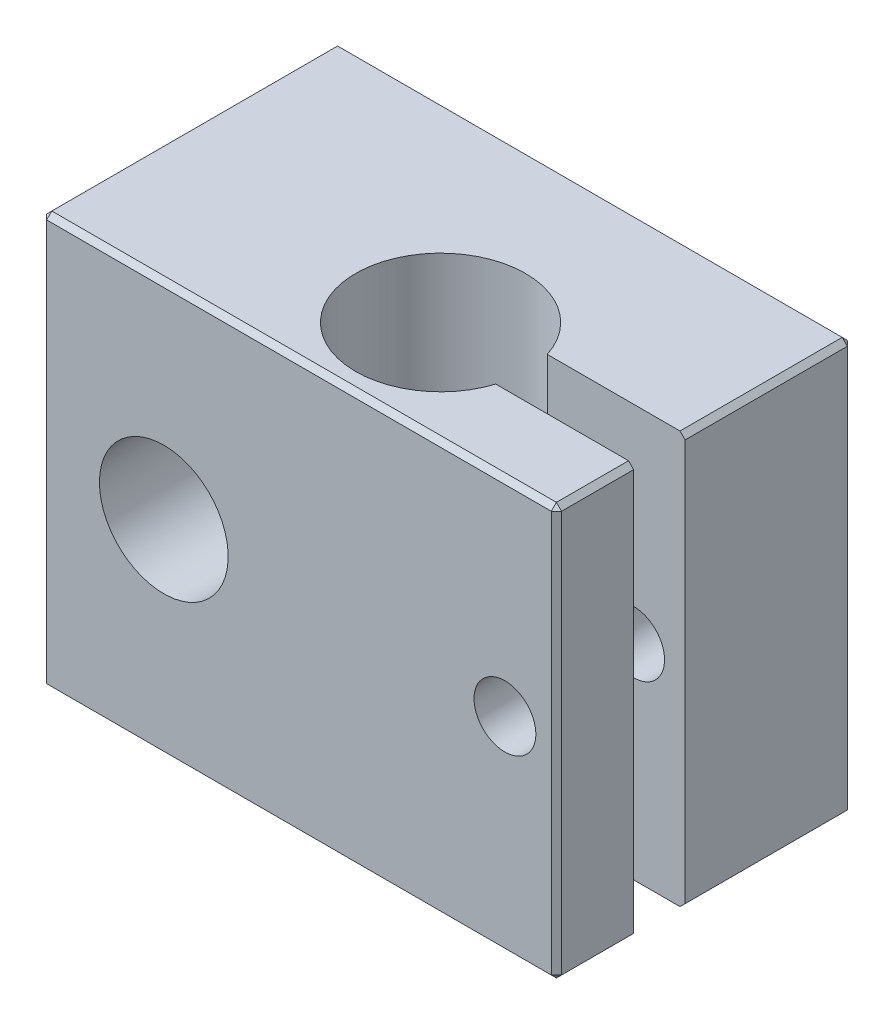
ISO-10303-21;
HEADER;
FILE_DESCRIPTION(('STEP AP214'),'2;1');
FILE_NAME('part.step','',(''),(''),'','','');
FILE_SCHEMA(('AUTOMOTIVE_DESIGN { 1 0 10303 214 1 1 1 1 }'));
ENDSEC;
DATA;
#1=APPLICATION_CONTEXT('core data for automotive mechanical design processes');
#2=APPLICATION_PROTOCOL_DEFINITION('international standard','automotive_design',2000,#1);
#3=PRODUCT_CONTEXT('',#1,'mechanical');
#4=PRODUCT('Part','Part','',(#3));
#5=PRODUCT_RELATED_PRODUCT_CATEGORY('part','',(#4));
#6=PRODUCT_DEFINITION_FORMATION('','',#4);
#7=PRODUCT_DEFINITION_CONTEXT('part definition',#1,'design');
#8=PRODUCT_DEFINITION('design','',#6,#7);
#9=PRODUCT_DEFINITION_SHAPE('','',#8);
#10=(LENGTH_UNIT() NAMED_UNIT(*) SI_UNIT(.MILLI.,.METRE.));
#11=(NAMED_UNIT(*) PLANE_ANGLE_UNIT() SI_UNIT($,.RADIAN.));
#12=(NAMED_UNIT(*) SI_UNIT($,.STERADIAN.) SOLID_ANGLE_UNIT());
#13=UNCERTAINTY_MEASURE_WITH_UNIT(LENGTH_MEASURE(1.E-05),#10,'distance_accuracy_value','');
#14=(GEOMETRIC_REPRESENTATION_CONTEXT(3) GLOBAL_UNCERTAINTY_ASSIGNED_CONTEXT((#13)) GLOBAL_UNIT_ASSIGNED_CONTEXT((#10,
#11,#12)) REPRESENTATION_CONTEXT('',''));
#15=CARTESIAN_POINT('',(0.,0.,0.));
#16=DIRECTION('',(0.,0.,1.));
#17=DIRECTION('',(1.,0.,0.));
#18=AXIS2_PLACEMENT_3D('',#15,#16,#17);
#19=CARTESIAN_POINT('',(15.25,8.,11.5));
#20=DIRECTION('',(1.,0.,0.));
#21=DIRECTION('',(0.,1.,0.));
#22=AXIS2_PLACEMENT_3D('',#19,#20,#21);
#23=PLANE('',#22);
#24=DIRECTION('',(0.,1.,0.));
#25=VECTOR('',#24,1.);
#26=CARTESIAN_POINT('',(15.25,-8.,8.5));
#27=LINE('',#26,#25);
#28=CARTESIAN_POINT('',(15.25,-7.80000000000001,8.5));
#29=VERTEX_POINT('',#28);
#30=CARTESIAN_POINT('',(15.25,7.80000000000001,8.5));
#31=VERTEX_POINT('',#30);
#32=EDGE_CURVE('E209',#29,#31,#27,.T.);
#33=ORIENTED_EDGE('',*,*,#32,.T.);
#34=DIRECTION('',(0.,0.,1.));
#35=VECTOR('',#34,1.);
#36=CARTESIAN_POINT('',(15.25,7.80000000000001,11.5));
#37=LINE('',#36,#35);
#38=CARTESIAN_POINT('',(15.25,7.80000000000001,11.3));
#39=VERTEX_POINT('',#38);
#40=EDGE_CURVE('E283',#31,#39,#37,.T.);
#41=ORIENTED_EDGE('',*,*,#40,.T.);
#42=DIRECTION('',(0.,-1.,0.));
#43=VECTOR('',#42,1.);
#44=CARTESIAN_POINT('',(15.25,-8.,11.3));
#45=LINE('',#44,#43);
#46=CARTESIAN_POINT('',(15.25,-7.80000000000001,11.3));
#47=VERTEX_POINT('',#46);
#48=EDGE_CURVE('E279',#39,#47,#45,.T.);
#49=ORIENTED_EDGE('',*,*,#48,.T.);
#50=DIRECTION('',(0.,0.,-1.));
#51=VECTOR('',#50,1.);
#52=CARTESIAN_POINT('',(15.25,-7.80000000000001,11.5));
#53=LINE('',#52,#51);
#54=EDGE_CURVE('E281',#47,#29,#53,.T.);
#55=ORIENTED_EDGE('',*,*,#54,.T.);
#56=EDGE_LOOP('',(#33,#41,#49,#55));
#57=FACE_BOUND('',#56,.T.);
#58=ADVANCED_FACE('F34',(#57),#23,.T.);
#59=DIRECTION('',(0.,1.,0.));
#60=VECTOR('',#59,1.);
#61=CARTESIAN_POINT('',(15.25,8.,0.199999999999995));
#62=LINE('',#61,#60);
#63=CARTESIAN_POINT('',(15.25,-7.80000000000001,0.199999999999995));
#64=VERTEX_POINT('',#63);
#65=CARTESIAN_POINT('',(15.25,7.80000000000001,0.199999999999995));
#66=VERTEX_POINT('',#65);
#67=EDGE_CURVE('E237',#64,#66,#62,.T.);
#68=ORIENTED_EDGE('',*,*,#67,.T.);
#69=DIRECTION('',(0.,0.,1.));
#70=VECTOR('',#69,1.);
#71=CARTESIAN_POINT('',(15.25,7.80000000000001,11.5));
#72=LINE('',#71,#70);
#73=CARTESIAN_POINT('',(15.25,7.80000000000001,6.5));
#74=VERTEX_POINT('',#73);
#75=EDGE_CURVE('E241',#66,#74,#72,.T.);
#76=ORIENTED_EDGE('',*,*,#75,.T.);
#77=DIRECTION('',(0.,1.,0.));
#78=VECTOR('',#77,1.);
#79=CARTESIAN_POINT('',(15.25,-8.,6.5));
#80=LINE('',#79,#78);
#81=CARTESIAN_POINT('',(15.25,-7.80000000000001,6.5));
#82=VERTEX_POINT('',#81);
#83=EDGE_CURVE('E220',#82,#74,#80,.T.);
#84=ORIENTED_EDGE('',*,*,#83,.F.);
#85=DIRECTION('',(0.,0.,-1.));
#86=VECTOR('',#85,1.);
#87=CARTESIAN_POINT('',(15.25,-7.80000000000001,11.5));
#88=LINE('',#87,#86);
#89=EDGE_CURVE('E239',#82,#64,#88,.T.);
#90=ORIENTED_EDGE('',*,*,#89,.T.);
#91=EDGE_LOOP('',(#68,#76,#84,#90));
#92=FACE_BOUND('',#91,.T.);
#93=ADVANCED_FACE('F395',(#92),#23,.T.);
#94=CARTESIAN_POINT('',(-4.75,8.,11.5));
#95=DIRECTION('',(0.,1.,0.));
#96=DIRECTION('',(0.,0.,1.));
#97=AXIS2_PLACEMENT_3D('',#94,#95,#96);
#98=PLANE('',#97);
#99=DIRECTION('',(-1.,0.,0.));
#100=VECTOR('',#99,1.);
#101=CARTESIAN_POINT('',(15.25,8.,6.5));
#102=LINE('',#101,#100);
#103=CARTESIAN_POINT('',(15.05,8.,6.5));
#104=VERTEX_POINT('',#103);
#105=CARTESIAN_POINT('',(9.89483703870327,8.,6.5));
#106=VERTEX_POINT('',#105);
#107=EDGE_CURVE('E207',#104,#106,#102,.T.);
#108=ORIENTED_EDGE('',*,*,#107,.F.);
#109=DIRECTION('',(0.,0.,-1.));
#110=VECTOR('',#109,1.);
#111=CARTESIAN_POINT('',(15.05,8.,11.5));
#112=LINE('',#111,#110);
#113=CARTESIAN_POINT('',(15.05,8.,0.199999999999995));
#114=VERTEX_POINT('',#113);
#115=EDGE_CURVE('E234',#104,#114,#112,.T.);
#116=ORIENTED_EDGE('',*,*,#115,.T.);
#117=DIRECTION('',(-1.,0.,0.));
#118=VECTOR('',#117,1.);
#119=CARTESIAN_POINT('',(-4.75,8.,0.199999999999995));
#120=LINE('',#119,#118);
#121=CARTESIAN_POINT('',(-4.55000000000001,8.,0.199999999999995));
#122=VERTEX_POINT('',#121);
#123=EDGE_CURVE('E232',#114,#122,#120,.T.);
#124=ORIENTED_EDGE('',*,*,#123,.T.);
#125=DIRECTION('',(0.,0.,1.));
#126=VECTOR('',#125,1.);
#127=CARTESIAN_POINT('',(-4.55000000000001,8.,11.5));
#128=LINE('',#127,#126);
#129=CARTESIAN_POINT('',(-4.55000000000001,8.,11.3));
#130=VERTEX_POINT('',#129);
#131=EDGE_CURVE('E228',#122,#130,#128,.T.);
#132=ORIENTED_EDGE('',*,*,#131,.T.);
#133=DIRECTION('',(1.,0.,0.));
#134=VECTOR('',#133,1.);
#135=CARTESIAN_POINT('',(15.25,8.,11.3));
#136=LINE('',#135,#134);
#137=CARTESIAN_POINT('',(15.05,8.,11.3));
#138=VERTEX_POINT('',#137);
#139=EDGE_CURVE('E216',#130,#138,#136,.T.);
#140=ORIENTED_EDGE('',*,*,#139,.T.);
#141=DIRECTION('',(0.,0.,-1.));
#142=VECTOR('',#141,1.);
#143=CARTESIAN_POINT('',(15.05,8.,11.5));
#144=LINE('',#143,#142);
#145=CARTESIAN_POINT('',(15.05,8.,8.5));
#146=VERTEX_POINT('',#145);
#147=EDGE_CURVE('E230',#138,#146,#144,.T.);
#148=ORIENTED_EDGE('',*,*,#147,.T.);
#149=DIRECTION('',(1.,0.,0.));
#150=VECTOR('',#149,1.);
#151=CARTESIAN_POINT('',(9.89483703870327,8.,8.5));
#152=LINE('',#151,#150);
#153=CARTESIAN_POINT('',(9.89483703870327,8.,8.5));
#154=VERTEX_POINT('',#153);
#155=EDGE_CURVE('E202',#154,#146,#152,.T.);
#156=ORIENTED_EDGE('',*,*,#155,.F.);
#157=CARTESIAN_POINT('',(6.75,8.,7.5));
#158=DIRECTION('',(0.,-1.,0.));
#159=DIRECTION('',(0.,0.,-1.));
#160=AXIS2_PLACEMENT_3D('',#157,#158,#159);
#161=CIRCLE('',#160,3.29999999999999);
#162=EDGE_CURVE('E199',#154,#106,#161,.T.);
#163=ORIENTED_EDGE('',*,*,#162,.T.);
#164=EDGE_LOOP('',(#108,#116,#124,#132,#140,#148,#156,#163));
#165=FACE_BOUND('',#164,.T.);
#166=ADVANCED_FACE('F401',(#165),#98,.T.);
#167=CARTESIAN_POINT('',(-4.75,-8.,11.5));
#168=DIRECTION('',(-1.,0.,0.));
#169=DIRECTION('',(0.,-1.,0.));
#170=AXIS2_PLACEMENT_3D('',#167,#168,#169);
#171=PLANE('',#170);
#172=DIRECTION('',(0.,0.,-1.));
#173=VECTOR('',#172,1.);
#174=CARTESIAN_POINT('',(-4.75,7.80000000000001,11.5));
#175=LINE('',#174,#173);
#176=CARTESIAN_POINT('',(-4.75,7.80000000000001,11.3));
#177=VERTEX_POINT('',#176);
#178=CARTESIAN_POINT('',(-4.75,7.80000000000001,0.199999999999995));
#179=VERTEX_POINT('',#178);
#180=EDGE_CURVE('E270',#177,#179,#175,.T.);
#181=ORIENTED_EDGE('',*,*,#180,.T.);
#182=DIRECTION('',(0.,-1.,0.));
#183=VECTOR('',#182,1.);
#184=CARTESIAN_POINT('',(-4.75,-8.,0.199999999999995));
#185=LINE('',#184,#183);
#186=CARTESIAN_POINT('',(-4.75,-7.80000000000001,0.199999999999995));
#187=VERTEX_POINT('',#186);
#188=EDGE_CURVE('E272',#179,#187,#185,.T.);
#189=ORIENTED_EDGE('',*,*,#188,.T.);
#190=DIRECTION('',(0.,0.,1.));
#191=VECTOR('',#190,1.);
#192=CARTESIAN_POINT('',(-4.75,-7.80000000000001,11.5));
#193=LINE('',#192,#191);
#194=CARTESIAN_POINT('',(-4.75,-7.80000000000001,11.3));
#195=VERTEX_POINT('',#194);
#196=EDGE_CURVE('E268',#187,#195,#193,.T.);
#197=ORIENTED_EDGE('',*,*,#196,.T.);
#198=DIRECTION('',(0.,1.,0.));
#199=VECTOR('',#198,1.);
#200=CARTESIAN_POINT('',(-4.75,8.,11.3));
#201=LINE('',#200,#199);
#202=EDGE_CURVE('E266',#195,#177,#201,.T.);
#203=ORIENTED_EDGE('',*,*,#202,.T.);
#204=EDGE_LOOP('',(#181,#189,#197,#203));
#205=FACE_BOUND('',#204,.T.);
#206=ADVANCED_FACE('F516',(#205),#171,.T.);
#207=CARTESIAN_POINT('',(15.25,-8.,11.5));
#208=DIRECTION('',(0.,-1.,0.));
#209=DIRECTION('',(0.,0.,-1.));
#210=AXIS2_PLACEMENT_3D('',#207,#208,#209);
#211=PLANE('',#210);
#212=CARTESIAN_POINT('',(-2.25,-8.,9.));
#213=DIRECTION('',(0.,-1.,0.));
#214=DIRECTION('',(0.,0.,-1.));
#215=AXIS2_PLACEMENT_3D('',#212,#213,#214);
#216=CIRCLE('',#215,0.999999999999994);
#217=CARTESIAN_POINT('',(-2.25,-8.,8.00000000000001));
#218=VERTEX_POINT('',#217);
#219=EDGE_CURVE('E355',#218,#218,#216,.T.);
#220=ORIENTED_EDGE('',*,*,#219,.F.);
#221=EDGE_LOOP('',(#220));
#222=FACE_BOUND('',#221,.T.);
#223=CARTESIAN_POINT('',(-1.25,-8.,6.5));
#224=DIRECTION('',(0.,-1.,0.));
#225=DIRECTION('',(0.,0.,-1.));
#226=AXIS2_PLACEMENT_3D('',#223,#224,#225);
#227=CIRCLE('',#226,1.02499999999999);
#228=CARTESIAN_POINT('',(-1.25,-8.,5.47500000000001));
#229=VERTEX_POINT('',#228);
#230=EDGE_CURVE('E174',#229,#229,#227,.T.);
#231=ORIENTED_EDGE('',*,*,#230,.F.);
#232=EDGE_LOOP('',(#231));
#233=FACE_BOUND('',#232,.T.);
#234=DIRECTION('',(1.,0.,0.));
#235=VECTOR('',#234,1.);
#236=CARTESIAN_POINT('',(15.25,-8.,0.199999999999995));
#237=LINE('',#236,#235);
#238=CARTESIAN_POINT('',(-4.55,-8.,0.199999999999995));
#239=VERTEX_POINT('',#238);
#240=CARTESIAN_POINT('',(15.05,-8.,0.199999999999995));
#241=VERTEX_POINT('',#240);
#242=EDGE_CURVE('E253',#239,#241,#237,.T.);
#243=ORIENTED_EDGE('',*,*,#242,.T.);
#244=DIRECTION('',(0.,0.,1.));
#245=VECTOR('',#244,1.);
#246=CARTESIAN_POINT('',(15.05,-8.,11.5));
#247=LINE('',#246,#245);
#248=CARTESIAN_POINT('',(15.05,-8.,6.5));
#249=VERTEX_POINT('',#248);
#250=EDGE_CURVE('E255',#241,#249,#247,.T.);
#251=ORIENTED_EDGE('',*,*,#250,.T.);
#252=DIRECTION('',(-1.,0.,0.));
#253=VECTOR('',#252,1.);
#254=CARTESIAN_POINT('',(15.25,-8.,6.5));
#255=LINE('',#254,#253);
#256=CARTESIAN_POINT('',(9.89483703870327,-8.,6.5));
#257=VERTEX_POINT('',#256);
#258=EDGE_CURVE('E206',#249,#257,#255,.T.);
#259=ORIENTED_EDGE('',*,*,#258,.T.);
#260=CARTESIAN_POINT('',(6.75,-8.,7.5));
#261=DIRECTION('',(0.,-1.,0.));
#262=DIRECTION('',(0.,0.,-1.));
#263=AXIS2_PLACEMENT_3D('',#260,#261,#262);
#264=CIRCLE('',#263,3.29999999999999);
#265=CARTESIAN_POINT('',(9.89483703870327,-8.,8.5));
#266=VERTEX_POINT('',#265);
#267=EDGE_CURVE('E196',#266,#257,#264,.T.);
#268=ORIENTED_EDGE('',*,*,#267,.F.);
#269=DIRECTION('',(1.,0.,0.));
#270=VECTOR('',#269,1.);
#271=CARTESIAN_POINT('',(9.89483703870327,-8.,8.5));
#272=LINE('',#271,#270);
#273=CARTESIAN_POINT('',(15.05,-8.,8.5));
#274=VERTEX_POINT('',#273);
#275=EDGE_CURVE('E203',#266,#274,#272,.T.);
#276=ORIENTED_EDGE('',*,*,#275,.T.);
#277=DIRECTION('',(0.,0.,1.));
#278=VECTOR('',#277,1.);
#279=CARTESIAN_POINT('',(15.05,-8.,11.5));
#280=LINE('',#279,#278);
#281=CARTESIAN_POINT('',(15.05,-8.,11.3));
#282=VERTEX_POINT('',#281);
#283=EDGE_CURVE('E251',#274,#282,#280,.T.);
#284=ORIENTED_EDGE('',*,*,#283,.T.);
#285=DIRECTION('',(-1.,0.,0.));
#286=VECTOR('',#285,1.);
#287=CARTESIAN_POINT('',(-4.75,-8.,11.3));
#288=LINE('',#287,#286);
#289=CARTESIAN_POINT('',(-4.55,-8.,11.3));
#290=VERTEX_POINT('',#289);
#291=EDGE_CURVE('E247',#282,#290,#288,.T.);
#292=ORIENTED_EDGE('',*,*,#291,.T.);
#293=DIRECTION('',(0.,0.,-1.));
#294=VECTOR('',#293,1.);
#295=CARTESIAN_POINT('',(-4.55,-8.,11.5));
#296=LINE('',#295,#294);
#297=EDGE_CURVE('E249',#290,#239,#296,.T.);
#298=ORIENTED_EDGE('',*,*,#297,.T.);
#299=EDGE_LOOP('',(#243,#251,#259,#268,#276,#284,#292,#298));
#300=FACE_BOUND('',#299,.T.);
#301=ADVANCED_FACE('F405',(#222,#233,#300),#211,.T.);
#302=CARTESIAN_POINT('',(0.,0.,11.5));
#303=DIRECTION('',(0.,0.,-1.));
#304=DIRECTION('',(-1.,0.,0.));
#305=AXIS2_PLACEMENT_3D('',#302,#303,#304);
#306=PLANE('',#305);
#307=DIRECTION('',(0.,1.,0.));
#308=VECTOR('',#307,1.);
#309=CARTESIAN_POINT('',(15.05,8.,11.5));
#310=LINE('',#309,#308);
#311=CARTESIAN_POINT('',(15.05,-7.80000000000001,11.5));
#312=VERTEX_POINT('',#311);
#313=CARTESIAN_POINT('',(15.05,7.80000000000001,11.5));
#314=VERTEX_POINT('',#313);
#315=EDGE_CURVE('E43',#312,#314,#310,.T.);
#316=ORIENTED_EDGE('',*,*,#315,.T.);
#317=DIRECTION('',(-1.,0.,0.));
#318=VECTOR('',#317,1.);
#319=CARTESIAN_POINT('',(-4.75,7.80000000000001,11.5));
#320=LINE('',#319,#318);
#321=CARTESIAN_POINT('',(-4.55000000000001,7.80000000000001,11.5));
#322=VERTEX_POINT('',#321);
#323=EDGE_CURVE('E11',#314,#322,#320,.T.);
#324=ORIENTED_EDGE('',*,*,#323,.T.);
#325=DIRECTION('',(0.,-1.,0.));
#326=VECTOR('',#325,1.);
#327=CARTESIAN_POINT('',(-4.55,-8.,11.5));
#328=LINE('',#327,#326);
#329=CARTESIAN_POINT('',(-4.55,-7.80000000000001,11.5));
#330=VERTEX_POINT('',#329);
#331=EDGE_CURVE('E287',#322,#330,#328,.T.);
#332=ORIENTED_EDGE('',*,*,#331,.T.);
#333=DIRECTION('',(1.,0.,0.));
#334=VECTOR('',#333,1.);
#335=CARTESIAN_POINT('',(15.25,-7.80000000000001,11.5));
#336=LINE('',#335,#334);
#337=EDGE_CURVE('E285',#330,#312,#336,.T.);
#338=ORIENTED_EDGE('',*,*,#337,.T.);
#339=EDGE_LOOP('',(#316,#324,#332,#338));
#340=FACE_BOUND('',#339,.T.);
#341=CARTESIAN_POINT('',(13.25,0.,11.5));
#342=DIRECTION('',(0.,0.,-1.));
#343=DIRECTION('',(-1.,0.,0.));
#344=AXIS2_PLACEMENT_3D('',#341,#342,#343);
#345=CIRCLE('',#344,1.19999999999998);
#346=CARTESIAN_POINT('',(12.05,0.,11.5));
#347=VERTEX_POINT('',#346);
#348=EDGE_CURVE('E177',#347,#347,#345,.T.);
#349=ORIENTED_EDGE('',*,*,#348,.T.);
#350=EDGE_LOOP('',(#349));
#351=FACE_BOUND('',#350,.T.);
#352=CARTESIAN_POINT('',(0.,0.,11.5));
#353=DIRECTION('',(0.,0.,-1.));
#354=DIRECTION('',(-1.,0.,0.));
#355=AXIS2_PLACEMENT_3D('',#352,#353,#354);
#356=CIRCLE('',#355,2.49999999999998);
#357=CARTESIAN_POINT('',(-2.49999999999998,0.,11.5));
#358=VERTEX_POINT('',#357);
#359=EDGE_CURVE('E193',#358,#358,#356,.T.);
#360=ORIENTED_EDGE('',*,*,#359,.T.);
#361=EDGE_LOOP('',(#360));
#362=FACE_BOUND('',#361,.T.);
#363=ADVANCED_FACE('F511',(#340,#351,#362),#306,.F.);
#364=CARTESIAN_POINT('',(0.,0.,0.));
#365=DIRECTION('',(0.,0.,-1.));
#366=DIRECTION('',(-1.,0.,0.));
#367=AXIS2_PLACEMENT_3D('',#364,#365,#366);
#368=PLANE('',#367);
#369=DIRECTION('',(1.,0.,0.));
#370=VECTOR('',#369,1.);
#371=CARTESIAN_POINT('',(0.,7.80000000000001,0.));
#372=LINE('',#371,#370);
#373=CARTESIAN_POINT('',(-4.55000000000001,7.80000000000001,0.));
#374=VERTEX_POINT('',#373);
#375=CARTESIAN_POINT('',(15.05,7.80000000000001,0.));
#376=VERTEX_POINT('',#375);
#377=EDGE_CURVE('E261',#374,#376,#372,.T.);
#378=ORIENTED_EDGE('',*,*,#377,.T.);
#379=DIRECTION('',(0.,-1.,0.));
#380=VECTOR('',#379,1.);
#381=CARTESIAN_POINT('',(15.05,0.,0.));
#382=LINE('',#381,#380);
#383=CARTESIAN_POINT('',(15.05,-7.80000000000001,0.));
#384=VERTEX_POINT('',#383);
#385=EDGE_CURVE('E263',#376,#384,#382,.T.);
#386=ORIENTED_EDGE('',*,*,#385,.T.);
#387=DIRECTION('',(-1.,0.,0.));
#388=VECTOR('',#387,1.);
#389=CARTESIAN_POINT('',(0.,-7.80000000000001,0.));
#390=LINE('',#389,#388);
#391=CARTESIAN_POINT('',(-4.55,-7.80000000000001,0.));
#392=VERTEX_POINT('',#391);
#393=EDGE_CURVE('E259',#384,#392,#390,.T.);
#394=ORIENTED_EDGE('',*,*,#393,.T.);
#395=DIRECTION('',(0.,1.,0.));
#396=VECTOR('',#395,1.);
#397=CARTESIAN_POINT('',(-4.55,0.,0.));
#398=LINE('',#397,#396);
#399=EDGE_CURVE('E257',#392,#374,#398,.T.);
#400=ORIENTED_EDGE('',*,*,#399,.T.);
#401=EDGE_LOOP('',(#378,#386,#394,#400));
#402=FACE_BOUND('',#401,.T.);
#403=CARTESIAN_POINT('',(13.25,0.,0.));
#404=DIRECTION('',(0.,0.,-1.));
#405=DIRECTION('',(-1.,0.,0.));
#406=AXIS2_PLACEMENT_3D('',#403,#404,#405);
#407=CIRCLE('',#406,1.19999999999998);
#408=CARTESIAN_POINT('',(12.05,0.,0.));
#409=VERTEX_POINT('',#408);
#410=EDGE_CURVE('E173',#409,#409,#407,.T.);
#411=ORIENTED_EDGE('',*,*,#410,.F.);
#412=EDGE_LOOP('',(#411));
#413=FACE_BOUND('',#412,.T.);
#414=CARTESIAN_POINT('',(0.,0.,0.));
#415=DIRECTION('',(0.,0.,-1.));
#416=DIRECTION('',(-1.,0.,0.));
#417=AXIS2_PLACEMENT_3D('',#414,#415,#416);
#418=CIRCLE('',#417,2.49999999999998);
#419=CARTESIAN_POINT('',(-2.49999999999998,0.,0.));
#420=VERTEX_POINT('',#419);
#421=EDGE_CURVE('E190',#420,#420,#418,.T.);
#422=ORIENTED_EDGE('',*,*,#421,.F.);
#423=EDGE_LOOP('',(#422));
#424=FACE_BOUND('',#423,.T.);
#425=ADVANCED_FACE('F554',(#402,#413,#424),#368,.T.);
#426=CARTESIAN_POINT('',(9.89483703870327,-8.,8.5));
#427=DIRECTION('',(0.,0.,1.));
#428=DIRECTION('',(1.,0.,0.));
#429=AXIS2_PLACEMENT_3D('',#426,#427,#428);
#430=PLANE('',#429);
#431=CARTESIAN_POINT('',(13.25,0.,8.5));
#432=DIRECTION('',(0.,0.,1.));
#433=DIRECTION('',(1.,0.,0.));
#434=AXIS2_PLACEMENT_3D('',#431,#432,#433);
#435=CIRCLE('',#434,1.19999999999998);
#436=CARTESIAN_POINT('',(14.45,0.,8.5));
#437=VERTEX_POINT('',#436);
#438=EDGE_CURVE('E187',#437,#437,#435,.T.);
#439=ORIENTED_EDGE('',*,*,#438,.T.);
#440=EDGE_LOOP('',(#439));
#441=FACE_BOUND('',#440,.T.);
#442=ORIENTED_EDGE('',*,*,#155,.T.);
#443=DIRECTION('',(-0.707106781186548,0.707106781186548,0.));
#444=VECTOR('',#443,1.);
#445=CARTESIAN_POINT('',(15.05,8.,8.5));
#446=LINE('',#445,#444);
#447=EDGE_CURVE('E277',#146,#31,#446,.F.);
#448=ORIENTED_EDGE('',*,*,#447,.T.);
#449=ORIENTED_EDGE('',*,*,#32,.F.);
#450=DIRECTION('',(0.707106781186548,0.707106781186548,0.));
#451=VECTOR('',#450,1.);
#452=CARTESIAN_POINT('',(15.25,-7.80000000000001,8.5));
#453=LINE('',#452,#451);
#454=EDGE_CURVE('E275',#29,#274,#453,.F.);
#455=ORIENTED_EDGE('',*,*,#454,.T.);
#456=ORIENTED_EDGE('',*,*,#275,.F.);
#457=DIRECTION('',(0.,1.,0.));
#458=VECTOR('',#457,1.);
#459=CARTESIAN_POINT('',(9.89483703870327,-8.,8.5));
#460=LINE('',#459,#458);
#461=EDGE_CURVE('E213',#266,#154,#460,.T.);
#462=ORIENTED_EDGE('',*,*,#461,.T.);
#463=EDGE_LOOP('',(#442,#448,#449,#455,#456,#462));
#464=FACE_BOUND('',#463,.T.);
#465=ADVANCED_FACE('F502',(#441,#464),#430,.F.);
#466=CARTESIAN_POINT('',(15.25,-8.,6.5));
#467=DIRECTION('',(0.,0.,-1.));
#468=DIRECTION('',(-1.,0.,0.));
#469=AXIS2_PLACEMENT_3D('',#466,#467,#468);
#470=PLANE('',#469);
#471=CARTESIAN_POINT('',(13.25,0.,6.5));
#472=DIRECTION('',(0.,0.,-1.));
#473=DIRECTION('',(-1.,0.,0.));
#474=AXIS2_PLACEMENT_3D('',#471,#472,#473);
#475=CIRCLE('',#474,1.19999999999998);
#476=CARTESIAN_POINT('',(12.05,0.,6.5));
#477=VERTEX_POINT('',#476);
#478=EDGE_CURVE('E186',#477,#477,#475,.T.);
#479=ORIENTED_EDGE('',*,*,#478,.T.);
#480=EDGE_LOOP('',(#479));
#481=FACE_BOUND('',#480,.T.);
#482=ORIENTED_EDGE('',*,*,#83,.T.);
#483=DIRECTION('',(0.707106781186548,-0.707106781186548,0.));
#484=VECTOR('',#483,1.);
#485=CARTESIAN_POINT('',(15.05,8.,6.5));
#486=LINE('',#485,#484);
#487=EDGE_CURVE('E245',#74,#104,#486,.F.);
#488=ORIENTED_EDGE('',*,*,#487,.T.);
#489=ORIENTED_EDGE('',*,*,#107,.T.);
#490=DIRECTION('',(0.,1.,0.));
#491=VECTOR('',#490,1.);
#492=CARTESIAN_POINT('',(9.89483703870327,-8.,6.5));
#493=LINE('',#492,#491);
#494=EDGE_CURVE('E217',#257,#106,#493,.T.);
#495=ORIENTED_EDGE('',*,*,#494,.F.);
#496=ORIENTED_EDGE('',*,*,#258,.F.);
#497=DIRECTION('',(-0.707106781186548,-0.707106781186548,0.));
#498=VECTOR('',#497,1.);
#499=CARTESIAN_POINT('',(15.25,-7.80000000000001,6.5));
#500=LINE('',#499,#498);
#501=EDGE_CURVE('E243',#249,#82,#500,.F.);
#502=ORIENTED_EDGE('',*,*,#501,.T.);
#503=EDGE_LOOP('',(#482,#488,#489,#495,#496,#502));
#504=FACE_BOUND('',#503,.T.);
#505=ADVANCED_FACE('F534',(#481,#504),#470,.F.);
#506=CARTESIAN_POINT('',(6.75,8.,7.5));
#507=DIRECTION('',(0.,-1.,0.));
#508=DIRECTION('',(0.,0.,-1.));
#509=AXIS2_PLACEMENT_3D('',#506,#507,#508);
#510=CYLINDRICAL_SURFACE('',#509,3.29999999999999);
#511=ORIENTED_EDGE('',*,*,#267,.T.);
#512=ORIENTED_EDGE('',*,*,#494,.T.);
#513=ORIENTED_EDGE('',*,*,#162,.F.);
#514=ORIENTED_EDGE('',*,*,#461,.F.);
#515=EDGE_LOOP('',(#511,#512,#513,#514));
#516=FACE_BOUND('',#515,.T.);
#517=ADVANCED_FACE('F550',(#516),#510,.F.);
#518=CARTESIAN_POINT('',(0.,0.,0.));
#519=DIRECTION('',(0.,0.,-1.));
#520=DIRECTION('',(-1.,0.,0.));
#521=AXIS2_PLACEMENT_3D('',#518,#519,#520);
#522=CYLINDRICAL_SURFACE('',#521,2.49999999999998);
#523=ORIENTED_EDGE('',*,*,#359,.F.);
#524=EDGE_LOOP('',(#523));
#525=FACE_BOUND('',#524,.T.);
#526=ORIENTED_EDGE('',*,*,#421,.T.);
#527=EDGE_LOOP('',(#526));
#528=FACE_BOUND('',#527,.T.);
#529=ADVANCED_FACE('F563',(#525,#528),#522,.F.);
#530=CARTESIAN_POINT('',(13.25,0.,0.));
#531=DIRECTION('',(0.,0.,-1.));
#532=DIRECTION('',(-1.,0.,0.));
#533=AXIS2_PLACEMENT_3D('',#530,#531,#532);
#534=CYLINDRICAL_SURFACE('',#533,1.19999999999998);
#535=ORIENTED_EDGE('',*,*,#410,.T.);
#536=EDGE_LOOP('',(#535));
#537=FACE_BOUND('',#536,.T.);
#538=ORIENTED_EDGE('',*,*,#478,.F.);
#539=EDGE_LOOP('',(#538));
#540=FACE_BOUND('',#539,.T.);
#541=ADVANCED_FACE('F565',(#537,#540),#534,.F.);
#542=ORIENTED_EDGE('',*,*,#348,.F.);
#543=EDGE_LOOP('',(#542));
#544=FACE_BOUND('',#543,.T.);
#545=ORIENTED_EDGE('',*,*,#438,.F.);
#546=EDGE_LOOP('',(#545));
#547=FACE_BOUND('',#546,.T.);
#548=ADVANCED_FACE('F167',(#544,#547),#534,.F.);
#549=CARTESIAN_POINT('',(-1.25,-3.5,6.5));
#550=DIRECTION('',(0.,-1.,0.));
#551=DIRECTION('',(0.,0.,-1.));
#552=AXIS2_PLACEMENT_3D('',#549,#550,#551);
#553=CONICAL_SURFACE('',#552,1.02499999999999,1.02974425866621);
#554=CARTESIAN_POINT('',(-1.25,-2.88411786548219,6.5));
#555=VERTEX_POINT('',#554);
#556=VERTEX_LOOP('',#555);
#557=FACE_BOUND('',#556,.T.);
#558=CARTESIAN_POINT('',(-1.25,-3.5,6.5));
#559=DIRECTION('',(0.,-1.,0.));
#560=DIRECTION('',(0.,0.,-1.));
#561=AXIS2_PLACEMENT_3D('',#558,#559,#560);
#562=CIRCLE('',#561,1.02499999999999);
#563=CARTESIAN_POINT('',(-1.25,-3.5,5.47500000000001));
#564=VERTEX_POINT('',#563);
#565=EDGE_CURVE('E171',#564,#564,#562,.T.);
#566=ORIENTED_EDGE('',*,*,#565,.T.);
#567=EDGE_LOOP('',(#566));
#568=FACE_BOUND('',#567,.T.);
#569=ADVANCED_FACE('F163',(#557,#568),#553,.F.);
#570=CARTESIAN_POINT('',(-1.25,-8.,6.5));
#571=DIRECTION('',(0.,-1.,0.));
#572=DIRECTION('',(0.,0.,-1.));
#573=AXIS2_PLACEMENT_3D('',#570,#571,#572);
#574=CYLINDRICAL_SURFACE('',#573,1.02499999999999);
#575=ORIENTED_EDGE('',*,*,#565,.F.);
#576=EDGE_LOOP('',(#575));
#577=FACE_BOUND('',#576,.T.);
#578=ORIENTED_EDGE('',*,*,#230,.T.);
#579=EDGE_LOOP('',(#578));
#580=FACE_BOUND('',#579,.T.);
#581=ADVANCED_FACE('F166',(#577,#580),#574,.F.);
#582=CARTESIAN_POINT('',(-2.25,-3.5,9.));
#583=DIRECTION('',(0.,1.,0.));
#584=DIRECTION('',(0.,0.,1.));
#585=AXIS2_PLACEMENT_3D('',#582,#583,#584);
#586=PLANE('',#585);
#587=CARTESIAN_POINT('',(-2.25,-3.5,9.));
#588=DIRECTION('',(0.,-1.,0.));
#589=DIRECTION('',(0.,0.,-1.));
#590=AXIS2_PLACEMENT_3D('',#587,#588,#589);
#591=CIRCLE('',#590,0.500000000000011);
#592=CARTESIAN_POINT('',(-2.25,-3.5,8.49999999999999));
#593=VERTEX_POINT('',#592);
#594=EDGE_CURVE('E180',#593,#593,#591,.T.);
#595=ORIENTED_EDGE('',*,*,#594,.T.);
#596=EDGE_LOOP('',(#595));
#597=FACE_BOUND('',#596,.T.);
#598=ADVANCED_FACE('F372',(#597),#586,.F.);
#599=CARTESIAN_POINT('',(-2.25,-8.,9.));
#600=DIRECTION('',(0.,-1.,0.));
#601=DIRECTION('',(0.,0.,-1.));
#602=AXIS2_PLACEMENT_3D('',#599,#600,#601);
#603=CYLINDRICAL_SURFACE('',#602,0.500000000000011);
#604=ORIENTED_EDGE('',*,*,#594,.F.);
#605=EDGE_LOOP('',(#604));
#606=FACE_BOUND('',#605,.T.);
#607=CARTESIAN_POINT('',(-2.25,-6.,9.));
#608=DIRECTION('',(0.,-1.,0.));
#609=DIRECTION('',(0.,0.,-1.));
#610=AXIS2_PLACEMENT_3D('',#607,#608,#609);
#611=CIRCLE('',#610,0.500000000000011);
#612=CARTESIAN_POINT('',(-2.25,-6.,8.49999999999999));
#613=VERTEX_POINT('',#612);
#614=EDGE_CURVE('E365',#613,#613,#611,.T.);
#615=ORIENTED_EDGE('',*,*,#614,.T.);
#616=EDGE_LOOP('',(#615));
#617=FACE_BOUND('',#616,.T.);
#618=ADVANCED_FACE('F374',(#606,#617),#603,.F.);
#619=CARTESIAN_POINT('',(-1.74999999999999,-6.,9.));
#620=DIRECTION('',(0.,1.,0.));
#621=DIRECTION('',(0.,0.,1.));
#622=AXIS2_PLACEMENT_3D('',#619,#620,#621);
#623=PLANE('',#622);
#624=ORIENTED_EDGE('',*,*,#614,.F.);
#625=EDGE_LOOP('',(#624));
#626=FACE_BOUND('',#625,.T.);
#627=CARTESIAN_POINT('',(-2.25,-6.,9.));
#628=DIRECTION('',(0.,-1.,0.));
#629=DIRECTION('',(0.,0.,-1.));
#630=AXIS2_PLACEMENT_3D('',#627,#628,#629);
#631=CIRCLE('',#630,0.999999999999994);
#632=CARTESIAN_POINT('',(-2.25,-6.,8.00000000000001));
#633=VERTEX_POINT('',#632);
#634=EDGE_CURVE('E360',#633,#633,#631,.T.);
#635=ORIENTED_EDGE('',*,*,#634,.T.);
#636=EDGE_LOOP('',(#635));
#637=FACE_BOUND('',#636,.T.);
#638=ADVANCED_FACE('F377',(#626,#637),#623,.F.);
#639=CARTESIAN_POINT('',(-2.25,-8.,9.));
#640=DIRECTION('',(0.,-1.,0.));
#641=DIRECTION('',(0.,0.,-1.));
#642=AXIS2_PLACEMENT_3D('',#639,#640,#641);
#643=CYLINDRICAL_SURFACE('',#642,0.999999999999994);
#644=ORIENTED_EDGE('',*,*,#634,.F.);
#645=EDGE_LOOP('',(#644));
#646=FACE_BOUND('',#645,.T.);
#647=ORIENTED_EDGE('',*,*,#219,.T.);
#648=EDGE_LOOP('',(#647));
#649=FACE_BOUND('',#648,.T.);
#650=ADVANCED_FACE('F383',(#646,#649),#643,.F.);
#651=CARTESIAN_POINT('',(15.25,-7.80000000000001,11.5));
#652=DIRECTION('',(-0.707106781186547,0.707106781186547,0.));
#653=DIRECTION('',(0.,0.,-1.));
#654=AXIS2_PLACEMENT_3D('',#651,#652,#653);
#655=PLANE('',#654);
#656=DIRECTION('',(-0.707106781186547,-0.707106781186547,0.));
#657=VECTOR('',#656,1.);
#658=CARTESIAN_POINT('',(15.05,-8.,11.3));
#659=LINE('',#658,#657);
#660=EDGE_CURVE('E38',#282,#47,#659,.F.);
#661=ORIENTED_EDGE('',*,*,#660,.F.);
#662=ORIENTED_EDGE('',*,*,#283,.F.);
#663=ORIENTED_EDGE('',*,*,#454,.F.);
#664=ORIENTED_EDGE('',*,*,#54,.F.);
#665=EDGE_LOOP('',(#661,#662,#663,#664));
#666=FACE_BOUND('',#665,.T.);
#667=ADVANCED_FACE('F36',(#666),#655,.F.);
#668=CARTESIAN_POINT('',(15.05,-8.,11.3));
#669=DIRECTION('',(0.577350269189628,-0.577350269189628,0.577350269189623));
#670=DIRECTION('',(0.707106781186548,0.707106781186548,0.));
#671=AXIS2_PLACEMENT_3D('',#668,#669,#670);
#672=PLANE('',#671);
#673=DIRECTION('',(0.,-0.707106781186547,-0.707106781186547));
#674=VECTOR('',#673,1.);
#675=CARTESIAN_POINT('',(15.05,-8.,11.3));
#676=LINE('',#675,#674);
#677=EDGE_CURVE('E347',#282,#312,#676,.F.);
#678=ORIENTED_EDGE('',*,*,#677,.F.);
#679=ORIENTED_EDGE('',*,*,#660,.T.);
#680=DIRECTION('',(-0.707106781186546,0.,0.707106781186549));
#681=VECTOR('',#680,1.);
#682=CARTESIAN_POINT('',(15.15,-7.80000000000001,11.4));
#683=LINE('',#682,#681);
#684=EDGE_CURVE('E349',#312,#47,#683,.F.);
#685=ORIENTED_EDGE('',*,*,#684,.F.);
#686=EDGE_LOOP('',(#678,#679,#685));
#687=FACE_BOUND('',#686,.T.);
#688=ADVANCED_FACE('F392',(#687),#672,.T.);
#689=CARTESIAN_POINT('',(15.05,8.,11.5));
#690=DIRECTION('',(-0.707106781186547,-0.707106781186547,0.));
#691=DIRECTION('',(0.,0.,-1.));
#692=AXIS2_PLACEMENT_3D('',#689,#690,#691);
#693=PLANE('',#692);
#694=ORIENTED_EDGE('',*,*,#447,.F.);
#695=ORIENTED_EDGE('',*,*,#147,.F.);
#696=DIRECTION('',(0.707106781186547,-0.707106781186547,0.));
#697=VECTOR('',#696,1.);
#698=CARTESIAN_POINT('',(15.25,7.80000000000001,11.3));
#699=LINE('',#698,#697);
#700=EDGE_CURVE('E344',#39,#138,#699,.F.);
#701=ORIENTED_EDGE('',*,*,#700,.F.);
#702=ORIENTED_EDGE('',*,*,#40,.F.);
#703=EDGE_LOOP('',(#694,#695,#701,#702));
#704=FACE_BOUND('',#703,.T.);
#705=ADVANCED_FACE('F481',(#704),#693,.F.);
#706=CARTESIAN_POINT('',(15.25,8.,11.3));
#707=DIRECTION('',(0.707106781186549,0.,0.707106781186546));
#708=DIRECTION('',(0.,1.,0.));
#709=AXIS2_PLACEMENT_3D('',#706,#707,#708);
#710=PLANE('',#709);
#711=ORIENTED_EDGE('',*,*,#684,.T.);
#712=ORIENTED_EDGE('',*,*,#48,.F.);
#713=DIRECTION('',(0.707106781186546,0.,-0.707106781186549));
#714=VECTOR('',#713,1.);
#715=CARTESIAN_POINT('',(15.25,7.80000000000001,11.3));
#716=LINE('',#715,#714);
#717=EDGE_CURVE('E341',#314,#39,#716,.T.);
#718=ORIENTED_EDGE('',*,*,#717,.F.);
#719=ORIENTED_EDGE('',*,*,#315,.F.);
#720=EDGE_LOOP('',(#711,#712,#718,#719));
#721=FACE_BOUND('',#720,.T.);
#722=ADVANCED_FACE('F477',(#721),#710,.T.);
#723=CARTESIAN_POINT('',(15.25,-8.,11.3));
#724=DIRECTION('',(0.,-0.707106781186547,0.707106781186547));
#725=DIRECTION('',(1.,0.,0.));
#726=AXIS2_PLACEMENT_3D('',#723,#724,#725);
#727=PLANE('',#726);
#728=ORIENTED_EDGE('',*,*,#677,.T.);
#729=ORIENTED_EDGE('',*,*,#337,.F.);
#730=DIRECTION('',(0.,0.707106781186547,0.707106781186547));
#731=VECTOR('',#730,1.);
#732=CARTESIAN_POINT('',(-4.55,-7.9,11.4));
#733=LINE('',#732,#731);
#734=EDGE_CURVE('E338',#290,#330,#733,.T.);
#735=ORIENTED_EDGE('',*,*,#734,.F.);
#736=ORIENTED_EDGE('',*,*,#291,.F.);
#737=EDGE_LOOP('',(#728,#729,#735,#736));
#738=FACE_BOUND('',#737,.T.);
#739=ADVANCED_FACE('F473',(#738),#727,.T.);
#740=CARTESIAN_POINT('',(15.25,7.80000000000001,11.3));
#741=DIRECTION('',(0.577350269189628,0.577350269189628,0.577350269189623));
#742=DIRECTION('',(-0.707106781186548,0.707106781186548,0.));
#743=AXIS2_PLACEMENT_3D('',#740,#741,#742);
#744=PLANE('',#743);
#745=ORIENTED_EDGE('',*,*,#717,.T.);
#746=ORIENTED_EDGE('',*,*,#700,.T.);
#747=DIRECTION('',(0.,-0.707106781186547,0.707106781186547));
#748=VECTOR('',#747,1.);
#749=CARTESIAN_POINT('',(15.05,7.9,11.4));
#750=LINE('',#749,#748);
#751=EDGE_CURVE('E335',#314,#138,#750,.F.);
#752=ORIENTED_EDGE('',*,*,#751,.F.);
#753=EDGE_LOOP('',(#745,#746,#752));
#754=FACE_BOUND('',#753,.T.);
#755=ADVANCED_FACE('F469',(#754),#744,.T.);
#756=CARTESIAN_POINT('',(-4.75,-7.80000000000001,11.3));
#757=DIRECTION('',(-0.577350269189626,-0.577350269189626,0.577350269189626));
#758=DIRECTION('',(0.707106781186547,0.,0.707106781186547));
#759=AXIS2_PLACEMENT_3D('',#756,#757,#758);
#760=PLANE('',#759);
#761=DIRECTION('',(-0.707106781186547,0.707106781186547,0.));
#762=VECTOR('',#761,1.);
#763=CARTESIAN_POINT('',(-4.75,-7.80000000000001,11.3));
#764=LINE('',#763,#762);
#765=EDGE_CURVE('E329',#290,#195,#764,.T.);
#766=ORIENTED_EDGE('',*,*,#765,.F.);
#767=ORIENTED_EDGE('',*,*,#734,.T.);
#768=DIRECTION('',(-0.707106781186547,0.,-0.707106781186547));
#769=VECTOR('',#768,1.);
#770=CARTESIAN_POINT('',(-4.75,-7.80000000000001,11.3));
#771=LINE('',#770,#769);
#772=EDGE_CURVE('E332',#195,#330,#771,.F.);
#773=ORIENTED_EDGE('',*,*,#772,.F.);
#774=EDGE_LOOP('',(#766,#767,#773));
#775=FACE_BOUND('',#774,.T.);
#776=ADVANCED_FACE('F465',(#775),#760,.T.);
#777=CARTESIAN_POINT('',(-4.75,8.,11.3));
#778=DIRECTION('',(0.,0.707106781186547,0.707106781186547));
#779=DIRECTION('',(-1.,0.,0.));
#780=AXIS2_PLACEMENT_3D('',#777,#778,#779);
#781=PLANE('',#780);
#782=ORIENTED_EDGE('',*,*,#751,.T.);
#783=ORIENTED_EDGE('',*,*,#139,.F.);
#784=DIRECTION('',(0.,0.707106781186547,-0.707106781186547));
#785=VECTOR('',#784,1.);
#786=CARTESIAN_POINT('',(-4.55000000000001,8.,11.3));
#787=LINE('',#786,#785);
#788=EDGE_CURVE('E327',#322,#130,#787,.T.);
#789=ORIENTED_EDGE('',*,*,#788,.F.);
#790=ORIENTED_EDGE('',*,*,#323,.F.);
#791=EDGE_LOOP('',(#782,#783,#789,#790));
#792=FACE_BOUND('',#791,.T.);
#793=ADVANCED_FACE('F461',(#792),#781,.T.);
#794=CARTESIAN_POINT('',(-4.75,-8.,11.3));
#795=DIRECTION('',(-0.707106781186547,0.,0.707106781186547));
#796=DIRECTION('',(0.,-1.,0.));
#797=AXIS2_PLACEMENT_3D('',#794,#795,#796);
#798=PLANE('',#797);
#799=ORIENTED_EDGE('',*,*,#772,.T.);
#800=ORIENTED_EDGE('',*,*,#331,.F.);
#801=DIRECTION('',(0.707106781186548,0.,0.707106781186548));
#802=VECTOR('',#801,1.);
#803=CARTESIAN_POINT('',(-4.65,7.80000000000001,11.4));
#804=LINE('',#803,#802);
#805=EDGE_CURVE('E57',#177,#322,#804,.T.);
#806=ORIENTED_EDGE('',*,*,#805,.F.);
#807=ORIENTED_EDGE('',*,*,#202,.F.);
#808=EDGE_LOOP('',(#799,#800,#806,#807));
#809=FACE_BOUND('',#808,.T.);
#810=ADVANCED_FACE('F457',(#809),#798,.T.);
#811=CARTESIAN_POINT('',(-4.55,-8.,11.5));
#812=DIRECTION('',(0.707106781186547,0.707106781186547,0.));
#813=DIRECTION('',(0.,0.,-1.));
#814=AXIS2_PLACEMENT_3D('',#811,#812,#813);
#815=PLANE('',#814);
#816=ORIENTED_EDGE('',*,*,#765,.T.);
#817=ORIENTED_EDGE('',*,*,#196,.F.);
#818=DIRECTION('',(0.707106781186547,-0.707106781186547,0.));
#819=VECTOR('',#818,1.);
#820=CARTESIAN_POINT('',(-4.65,-7.9,0.199999999999995));
#821=LINE('',#820,#819);
#822=EDGE_CURVE('E323',#239,#187,#821,.F.);
#823=ORIENTED_EDGE('',*,*,#822,.F.);
#824=ORIENTED_EDGE('',*,*,#297,.F.);
#825=EDGE_LOOP('',(#816,#817,#823,#824));
#826=FACE_BOUND('',#825,.T.);
#827=ADVANCED_FACE('F454',(#826),#815,.F.);
#828=CARTESIAN_POINT('',(-4.55000000000001,8.,11.3));
#829=DIRECTION('',(-0.577350269189626,0.577350269189626,0.577350269189626));
#830=DIRECTION('',(0.707106781186547,0.,0.707106781186547));
#831=AXIS2_PLACEMENT_3D('',#828,#829,#830);
#832=PLANE('',#831);
#833=ORIENTED_EDGE('',*,*,#805,.T.);
#834=ORIENTED_EDGE('',*,*,#788,.T.);
#835=DIRECTION('',(0.707106781186547,0.707106781186547,0.));
#836=VECTOR('',#835,1.);
#837=CARTESIAN_POINT('',(-4.55000000000001,8.,11.3));
#838=LINE('',#837,#836);
#839=EDGE_CURVE('E320',#177,#130,#838,.T.);
#840=ORIENTED_EDGE('',*,*,#839,.F.);
#841=EDGE_LOOP('',(#833,#834,#840));
#842=FACE_BOUND('',#841,.T.);
#843=ADVANCED_FACE('F450',(#842),#832,.T.);
#844=CARTESIAN_POINT('',(-4.55,-7.80000000000001,0.));
#845=DIRECTION('',(-0.577350269189626,-0.577350269189626,-0.577350269189626));
#846=DIRECTION('',(-0.707106781186547,0.,0.707106781186548));
#847=AXIS2_PLACEMENT_3D('',#844,#845,#846);
#848=PLANE('',#847);
#849=DIRECTION('',(0.,0.707106781186548,-0.707106781186548));
#850=VECTOR('',#849,1.);
#851=CARTESIAN_POINT('',(-4.55,-7.80000000000001,0.));
#852=LINE('',#851,#850);
#853=EDGE_CURVE('E315',#239,#392,#852,.T.);
#854=ORIENTED_EDGE('',*,*,#853,.F.);
#855=ORIENTED_EDGE('',*,*,#822,.T.);
#856=DIRECTION('',(-0.707106781186547,0.,0.707106781186547));
#857=VECTOR('',#856,1.);
#858=CARTESIAN_POINT('',(-4.55,-7.80000000000001,0.));
#859=LINE('',#858,#857);
#860=EDGE_CURVE('E318',#392,#187,#859,.T.);
#861=ORIENTED_EDGE('',*,*,#860,.F.);
#862=EDGE_LOOP('',(#854,#855,#861));
#863=FACE_BOUND('',#862,.T.);
#864=ADVANCED_FACE('F446',(#863),#848,.T.);
#865=CARTESIAN_POINT('',(-4.75,7.80000000000001,11.5));
#866=DIRECTION('',(0.707106781186547,-0.707106781186547,0.));
#867=DIRECTION('',(0.,0.,-1.));
#868=AXIS2_PLACEMENT_3D('',#865,#866,#867);
#869=PLANE('',#868);
#870=ORIENTED_EDGE('',*,*,#839,.T.);
#871=ORIENTED_EDGE('',*,*,#131,.F.);
#872=DIRECTION('',(-0.707106781186547,-0.707106781186547,0.));
#873=VECTOR('',#872,1.);
#874=CARTESIAN_POINT('',(-4.55000000000001,8.,0.199999999999995));
#875=LINE('',#874,#873);
#876=EDGE_CURVE('E312',#179,#122,#875,.F.);
#877=ORIENTED_EDGE('',*,*,#876,.F.);
#878=ORIENTED_EDGE('',*,*,#180,.F.);
#879=EDGE_LOOP('',(#870,#871,#877,#878));
#880=FACE_BOUND('',#879,.T.);
#881=ADVANCED_FACE('F442',(#880),#869,.F.);
#882=CARTESIAN_POINT('',(-4.55,0.,0.));
#883=DIRECTION('',(0.707106781186547,0.,0.707106781186547));
#884=DIRECTION('',(0.,1.,0.));
#885=AXIS2_PLACEMENT_3D('',#882,#883,#884);
#886=PLANE('',#885);
#887=ORIENTED_EDGE('',*,*,#860,.T.);
#888=ORIENTED_EDGE('',*,*,#188,.F.);
#889=DIRECTION('',(0.707106781186548,0.,-0.707106781186548));
#890=VECTOR('',#889,1.);
#891=CARTESIAN_POINT('',(-4.65,7.80000000000001,0.0999999999999977));
#892=LINE('',#891,#890);
#893=EDGE_CURVE('E309',#374,#179,#892,.F.);
#894=ORIENTED_EDGE('',*,*,#893,.F.);
#895=ORIENTED_EDGE('',*,*,#399,.F.);
#896=EDGE_LOOP('',(#887,#888,#894,#895));
#897=FACE_BOUND('',#896,.T.);
#898=ADVANCED_FACE('F438',(#897),#886,.F.);
#899=CARTESIAN_POINT('',(0.,-7.80000000000001,0.));
#900=DIRECTION('',(0.,0.707106781186547,0.707106781186547));
#901=DIRECTION('',(-1.,0.,0.));
#902=AXIS2_PLACEMENT_3D('',#899,#900,#901);
#903=PLANE('',#902);
#904=ORIENTED_EDGE('',*,*,#853,.T.);
#905=ORIENTED_EDGE('',*,*,#393,.F.);
#906=DIRECTION('',(0.,-0.707106781186547,0.707106781186547));
#907=VECTOR('',#906,1.);
#908=CARTESIAN_POINT('',(15.05,-7.9,0.0999999999999968));
#909=LINE('',#908,#907);
#910=EDGE_CURVE('E306',#241,#384,#909,.F.);
#911=ORIENTED_EDGE('',*,*,#910,.F.);
#912=ORIENTED_EDGE('',*,*,#242,.F.);
#913=EDGE_LOOP('',(#904,#905,#911,#912));
#914=FACE_BOUND('',#913,.T.);
#915=ADVANCED_FACE('F434',(#914),#903,.F.);
#916=CARTESIAN_POINT('',(15.25,-7.80000000000001,11.5));
#917=DIRECTION('',(-0.707106781186547,0.707106781186547,0.));
#918=DIRECTION('',(0.,0.,-1.));
#919=AXIS2_PLACEMENT_3D('',#916,#917,#918);
#920=PLANE('',#919);
#921=ORIENTED_EDGE('',*,*,#501,.F.);
#922=ORIENTED_EDGE('',*,*,#250,.F.);
#923=DIRECTION('',(0.707106781186547,0.707106781186547,0.));
#924=VECTOR('',#923,1.);
#925=CARTESIAN_POINT('',(15.25,-7.80000000000001,0.199999999999995));
#926=LINE('',#925,#924);
#927=EDGE_CURVE('E303',#64,#241,#926,.F.);
#928=ORIENTED_EDGE('',*,*,#927,.F.);
#929=ORIENTED_EDGE('',*,*,#89,.F.);
#930=EDGE_LOOP('',(#921,#922,#928,#929));
#931=FACE_BOUND('',#930,.T.);
#932=ADVANCED_FACE('F430',(#931),#920,.F.);
#933=CARTESIAN_POINT('',(-4.55000000000001,8.,0.199999999999995));
#934=DIRECTION('',(-0.577350269189626,0.577350269189626,-0.577350269189626));
#935=DIRECTION('',(-0.707106781186547,0.,0.707106781186548));
#936=AXIS2_PLACEMENT_3D('',#933,#934,#935);
#937=PLANE('',#936);
#938=ORIENTED_EDGE('',*,*,#893,.T.);
#939=ORIENTED_EDGE('',*,*,#876,.T.);
#940=DIRECTION('',(0.,0.707106781186548,0.707106781186548));
#941=VECTOR('',#940,1.);
#942=CARTESIAN_POINT('',(-4.55000000000001,8.,0.199999999999995));
#943=LINE('',#942,#941);
#944=EDGE_CURVE('E300',#374,#122,#943,.T.);
#945=ORIENTED_EDGE('',*,*,#944,.F.);
#946=EDGE_LOOP('',(#938,#939,#945));
#947=FACE_BOUND('',#946,.T.);
#948=ADVANCED_FACE('F426',(#947),#937,.T.);
#949=CARTESIAN_POINT('',(15.25,-7.80000000000001,0.199999999999995));
#950=DIRECTION('',(0.577350269189628,-0.577350269189628,-0.577350269189623));
#951=DIRECTION('',(0.707106781186548,0.707106781186548,0.));
#952=AXIS2_PLACEMENT_3D('',#949,#950,#951);
#953=PLANE('',#952);
#954=ORIENTED_EDGE('',*,*,#927,.T.);
#955=ORIENTED_EDGE('',*,*,#910,.T.);
#956=DIRECTION('',(-0.707106781186546,0.,-0.707106781186549));
#957=VECTOR('',#956,1.);
#958=CARTESIAN_POINT('',(15.25,-7.80000000000001,0.199999999999995));
#959=LINE('',#958,#957);
#960=EDGE_CURVE('E298',#64,#384,#959,.T.);
#961=ORIENTED_EDGE('',*,*,#960,.F.);
#962=EDGE_LOOP('',(#954,#955,#961));
#963=FACE_BOUND('',#962,.T.);
#964=ADVANCED_FACE('F422',(#963),#953,.T.);
#965=CARTESIAN_POINT('',(0.,7.80000000000001,0.));
#966=DIRECTION('',(0.,-0.707106781186547,0.707106781186547));
#967=DIRECTION('',(1.,0.,0.));
#968=AXIS2_PLACEMENT_3D('',#965,#966,#967);
#969=PLANE('',#968);
#970=ORIENTED_EDGE('',*,*,#944,.T.);
#971=ORIENTED_EDGE('',*,*,#123,.F.);
#972=DIRECTION('',(0.,-0.707106781186547,-0.707106781186547));
#973=VECTOR('',#972,1.);
#974=CARTESIAN_POINT('',(15.05,8.,0.199999999999995));
#975=LINE('',#974,#973);
#976=EDGE_CURVE('E295',#376,#114,#975,.F.);
#977=ORIENTED_EDGE('',*,*,#976,.F.);
#978=ORIENTED_EDGE('',*,*,#377,.F.);
#979=EDGE_LOOP('',(#970,#971,#977,#978));
#980=FACE_BOUND('',#979,.T.);
#981=ADVANCED_FACE('F418',(#980),#969,.F.);
#982=CARTESIAN_POINT('',(15.05,0.,0.));
#983=DIRECTION('',(-0.707106781186549,0.,0.707106781186546));
#984=DIRECTION('',(0.,-1.,0.));
#985=AXIS2_PLACEMENT_3D('',#982,#983,#984);
#986=PLANE('',#985);
#987=ORIENTED_EDGE('',*,*,#960,.T.);
#988=ORIENTED_EDGE('',*,*,#385,.F.);
#989=DIRECTION('',(0.707106781186546,0.,0.707106781186549));
#990=VECTOR('',#989,1.);
#991=CARTESIAN_POINT('',(15.15,7.80000000000001,0.0999999999999972));
#992=LINE('',#991,#990);
#993=EDGE_CURVE('E292',#66,#376,#992,.F.);
#994=ORIENTED_EDGE('',*,*,#993,.F.);
#995=ORIENTED_EDGE('',*,*,#67,.F.);
#996=EDGE_LOOP('',(#987,#988,#994,#995));
#997=FACE_BOUND('',#996,.T.);
#998=ADVANCED_FACE('F414',(#997),#986,.F.);
#999=CARTESIAN_POINT('',(15.05,8.,0.199999999999995));
#1000=DIRECTION('',(0.577350269189628,0.577350269189628,-0.577350269189623));
#1001=DIRECTION('',(-0.707106781186548,0.707106781186548,0.));
#1002=AXIS2_PLACEMENT_3D('',#999,#1000,#1001);
#1003=PLANE('',#1002);
#1004=ORIENTED_EDGE('',*,*,#993,.T.);
#1005=ORIENTED_EDGE('',*,*,#976,.T.);
#1006=DIRECTION('',(-0.707106781186547,0.707106781186547,0.));
#1007=VECTOR('',#1006,1.);
#1008=CARTESIAN_POINT('',(15.05,8.,0.199999999999995));
#1009=LINE('',#1008,#1007);
#1010=EDGE_CURVE('E290',#66,#114,#1009,.T.);
#1011=ORIENTED_EDGE('',*,*,#1010,.F.);
#1012=EDGE_LOOP('',(#1004,#1005,#1011));
#1013=FACE_BOUND('',#1012,.T.);
#1014=ADVANCED_FACE('F410',(#1013),#1003,.T.);
#1015=CARTESIAN_POINT('',(15.05,8.,11.5));
#1016=DIRECTION('',(-0.707106781186547,-0.707106781186547,0.));
#1017=DIRECTION('',(0.,0.,-1.));
#1018=AXIS2_PLACEMENT_3D('',#1015,#1016,#1017);
#1019=PLANE('',#1018);
#1020=ORIENTED_EDGE('',*,*,#487,.F.);
#1021=ORIENTED_EDGE('',*,*,#75,.F.);
#1022=ORIENTED_EDGE('',*,*,#1010,.T.);
#1023=ORIENTED_EDGE('',*,*,#115,.F.);
#1024=EDGE_LOOP('',(#1020,#1021,#1022,#1023));
#1025=FACE_BOUND('',#1024,.T.);
#1026=ADVANCED_FACE('F407',(#1025),#1019,.F.);
#1027=CLOSED_SHELL('',(#58,#93,#166,#206,#301,#363,#425,#465,#505,#517,#529,#541,#548,#569,#581,
#598,#618,#638,#650,#667,#688,#705,#722,#739,#755,#776,#793,#810,#827,#843,#864,#881,#898,#915,
#932,#948,#964,#981,#998,#1014,#1026));
#1028=MANIFOLD_SOLID_BREP('B2',#1027);
#1029=ADVANCED_BREP_SHAPE_REPRESENTATION('',(#18,#1028),#14);
#1030=SHAPE_DEFINITION_REPRESENTATION(#9,#1029);
ENDSEC;
END-ISO-10303-21;
